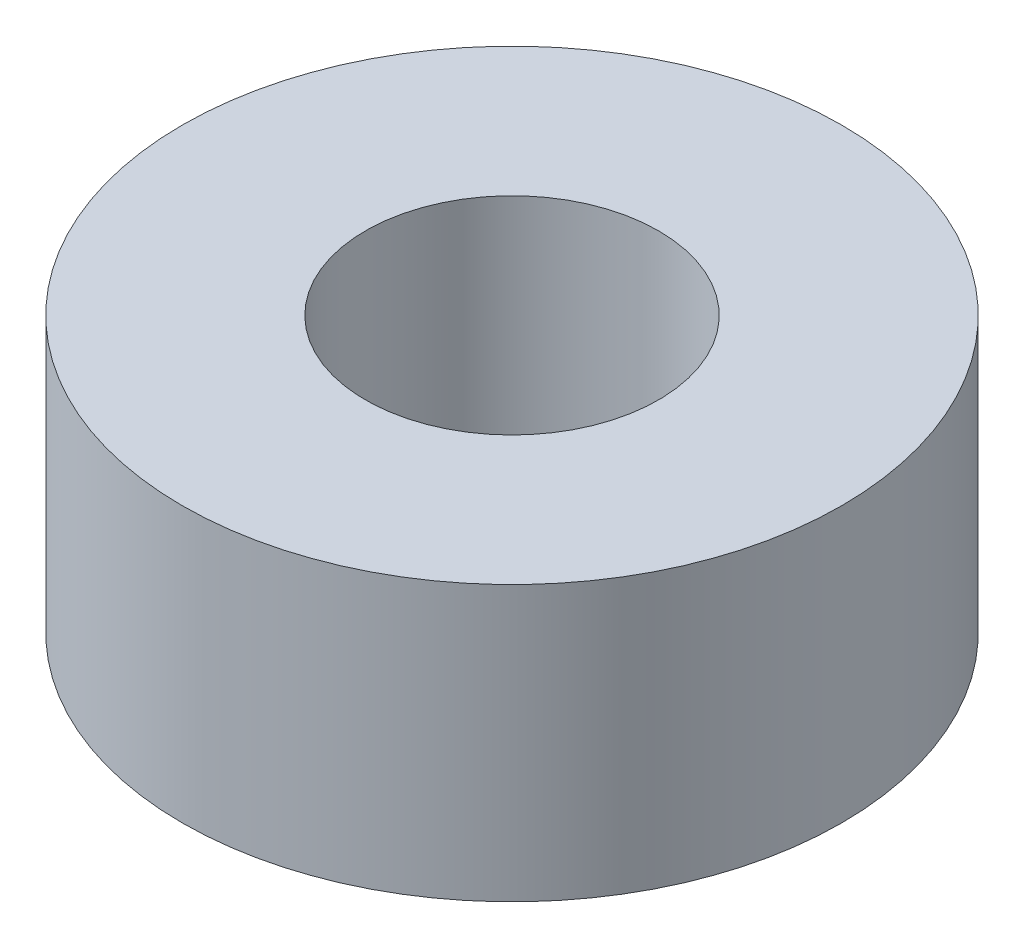
ISO-10303-21;
HEADER;
FILE_DESCRIPTION(('STEP AP214'),'2;1');
FILE_NAME('part.step','',(''),(''),'','','');
FILE_SCHEMA(('AUTOMOTIVE_DESIGN { 1 0 10303 214 1 1 1 1 }'));
ENDSEC;
DATA;
#1=APPLICATION_CONTEXT('core data for automotive mechanical design processes');
#2=APPLICATION_PROTOCOL_DEFINITION('international standard','automotive_design',2000,#1);
#3=PRODUCT_CONTEXT('',#1,'mechanical');
#4=PRODUCT('Part','Part','',(#3));
#5=PRODUCT_RELATED_PRODUCT_CATEGORY('part','',(#4));
#6=PRODUCT_DEFINITION_FORMATION('','',#4);
#7=PRODUCT_DEFINITION_CONTEXT('part definition',#1,'design');
#8=PRODUCT_DEFINITION('design','',#6,#7);
#9=PRODUCT_DEFINITION_SHAPE('','',#8);
#10=(LENGTH_UNIT() NAMED_UNIT(*) SI_UNIT(.MILLI.,.METRE.));
#11=(NAMED_UNIT(*) PLANE_ANGLE_UNIT() SI_UNIT($,.RADIAN.));
#12=(NAMED_UNIT(*) SI_UNIT($,.STERADIAN.) SOLID_ANGLE_UNIT());
#13=UNCERTAINTY_MEASURE_WITH_UNIT(LENGTH_MEASURE(1.E-05),#10,'distance_accuracy_value','');
#14=(GEOMETRIC_REPRESENTATION_CONTEXT(3) GLOBAL_UNCERTAINTY_ASSIGNED_CONTEXT((#13)) GLOBAL_UNIT_ASSIGNED_CONTEXT((#10,
#11,#12)) REPRESENTATION_CONTEXT('',''));
#15=CARTESIAN_POINT('',(0.,0.,0.));
#16=DIRECTION('',(0.,0.,1.));
#17=DIRECTION('',(1.,0.,0.));
#18=AXIS2_PLACEMENT_3D('',#15,#16,#17);
#19=CARTESIAN_POINT('',(0.,0.,0.));
#20=DIRECTION('',(0.,-1.,0.));
#21=DIRECTION('',(0.,0.,-1.));
#22=AXIS2_PLACEMENT_3D('',#19,#20,#21);
#23=CYLINDRICAL_SURFACE('',#22,1.6);
#24=CARTESIAN_POINT('',(0.,0.,0.));
#25=DIRECTION('',(0.,-1.,0.));
#26=DIRECTION('',(0.,0.,-1.));
#27=AXIS2_PLACEMENT_3D('',#24,#25,#26);
#28=CIRCLE('',#27,1.6);
#29=CARTESIAN_POINT('',(0.,0.,-1.6));
#30=VERTEX_POINT('',#29);
#31=EDGE_CURVE('E54',#30,#30,#28,.T.);
#32=ORIENTED_EDGE('',*,*,#31,.T.);
#33=EDGE_LOOP('',(#32));
#34=FACE_BOUND('',#33,.T.);
#35=CARTESIAN_POINT('',(0.,3.,0.));
#36=DIRECTION('',(0.,-1.,0.));
#37=DIRECTION('',(0.,0.,-1.));
#38=AXIS2_PLACEMENT_3D('',#35,#36,#37);
#39=CIRCLE('',#38,1.6);
#40=CARTESIAN_POINT('',(0.,3.,-1.6));
#41=VERTEX_POINT('',#40);
#42=EDGE_CURVE('E10',#41,#41,#39,.T.);
#43=ORIENTED_EDGE('',*,*,#42,.F.);
#44=EDGE_LOOP('',(#43));
#45=FACE_BOUND('',#44,.T.);
#46=ADVANCED_FACE('F37',(#34,#45),#23,.F.);
#47=CARTESIAN_POINT('',(1.6,3.,0.));
#48=DIRECTION('',(0.,1.,0.));
#49=DIRECTION('',(0.,0.,1.));
#50=AXIS2_PLACEMENT_3D('',#47,#48,#49);
#51=PLANE('',#50);
#52=ORIENTED_EDGE('',*,*,#42,.T.);
#53=EDGE_LOOP('',(#52));
#54=FACE_BOUND('',#53,.T.);
#55=CARTESIAN_POINT('',(0.,3.,0.));
#56=DIRECTION('',(0.,-1.,0.));
#57=DIRECTION('',(0.,0.,-1.));
#58=AXIS2_PLACEMENT_3D('',#55,#56,#57);
#59=CIRCLE('',#58,3.6);
#60=CARTESIAN_POINT('',(0.,3.,-3.6));
#61=VERTEX_POINT('',#60);
#62=EDGE_CURVE('E44',#61,#61,#59,.T.);
#63=ORIENTED_EDGE('',*,*,#62,.F.);
#64=EDGE_LOOP('',(#63));
#65=FACE_BOUND('',#64,.T.);
#66=ADVANCED_FACE('F71',(#54,#65),#51,.T.);
#67=CARTESIAN_POINT('',(0.,0.,0.));
#68=DIRECTION('',(0.,-1.,0.));
#69=DIRECTION('',(0.,0.,-1.));
#70=AXIS2_PLACEMENT_3D('',#67,#68,#69);
#71=CYLINDRICAL_SURFACE('',#70,3.6);
#72=ORIENTED_EDGE('',*,*,#62,.T.);
#73=EDGE_LOOP('',(#72));
#74=FACE_BOUND('',#73,.T.);
#75=CARTESIAN_POINT('',(0.,0.,0.));
#76=DIRECTION('',(0.,-1.,0.));
#77=DIRECTION('',(0.,0.,-1.));
#78=AXIS2_PLACEMENT_3D('',#75,#76,#77);
#79=CIRCLE('',#78,3.6);
#80=CARTESIAN_POINT('',(0.,0.,-3.6));
#81=VERTEX_POINT('',#80);
#82=EDGE_CURVE('E49',#81,#81,#79,.T.);
#83=ORIENTED_EDGE('',*,*,#82,.F.);
#84=EDGE_LOOP('',(#83));
#85=FACE_BOUND('',#84,.T.);
#86=ADVANCED_FACE('F65',(#74,#85),#71,.T.);
#87=CARTESIAN_POINT('',(1.6,0.,0.));
#88=DIRECTION('',(0.,-1.,0.));
#89=DIRECTION('',(0.,0.,-1.));
#90=AXIS2_PLACEMENT_3D('',#87,#88,#89);
#91=PLANE('',#90);
#92=ORIENTED_EDGE('',*,*,#82,.T.);
#93=EDGE_LOOP('',(#92));
#94=FACE_BOUND('',#93,.T.);
#95=ORIENTED_EDGE('',*,*,#31,.F.);
#96=EDGE_LOOP('',(#95));
#97=FACE_BOUND('',#96,.T.);
#98=ADVANCED_FACE('F63',(#94,#97),#91,.T.);
#99=CLOSED_SHELL('',(#46,#66,#86,#98));
#100=MANIFOLD_SOLID_BREP('B2',#99);
#101=ADVANCED_BREP_SHAPE_REPRESENTATION('',(#18,#100),#14);
#102=SHAPE_DEFINITION_REPRESENTATION(#9,#101);
ENDSEC;
END-ISO-10303-21;
